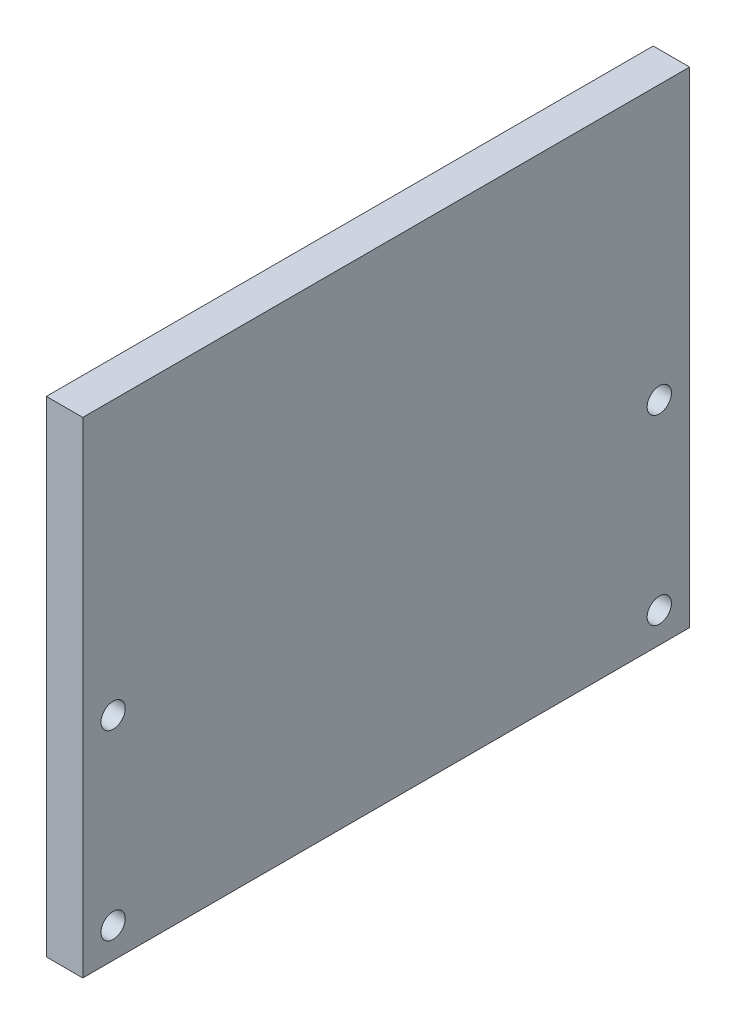
ISO-10303-21;
HEADER;
FILE_DESCRIPTION(('STEP AP214'),'2;1');
FILE_NAME('part.step','',(''),(''),'','','');
FILE_SCHEMA(('AUTOMOTIVE_DESIGN { 1 0 10303 214 1 1 1 1 }'));
ENDSEC;
DATA;
#1=APPLICATION_CONTEXT('core data for automotive mechanical design processes');
#2=APPLICATION_PROTOCOL_DEFINITION('international standard','automotive_design',2000,#1);
#3=PRODUCT_CONTEXT('',#1,'mechanical');
#4=PRODUCT('Part','Part','',(#3));
#5=PRODUCT_RELATED_PRODUCT_CATEGORY('part','',(#4));
#6=PRODUCT_DEFINITION_FORMATION('','',#4);
#7=PRODUCT_DEFINITION_CONTEXT('part definition',#1,'design');
#8=PRODUCT_DEFINITION('design','',#6,#7);
#9=PRODUCT_DEFINITION_SHAPE('','',#8);
#10=(LENGTH_UNIT() NAMED_UNIT(*) SI_UNIT(.MILLI.,.METRE.));
#11=(NAMED_UNIT(*) PLANE_ANGLE_UNIT() SI_UNIT($,.RADIAN.));
#12=(NAMED_UNIT(*) SI_UNIT($,.STERADIAN.) SOLID_ANGLE_UNIT());
#13=UNCERTAINTY_MEASURE_WITH_UNIT(LENGTH_MEASURE(1.E-05),#10,'distance_accuracy_value','');
#14=(GEOMETRIC_REPRESENTATION_CONTEXT(3) GLOBAL_UNCERTAINTY_ASSIGNED_CONTEXT((#13)) GLOBAL_UNIT_ASSIGNED_CONTEXT((#10,
#11,#12)) REPRESENTATION_CONTEXT('',''));
#15=CARTESIAN_POINT('',(0.,0.,0.));
#16=DIRECTION('',(0.,0.,1.));
#17=DIRECTION('',(1.,0.,0.));
#18=AXIS2_PLACEMENT_3D('',#15,#16,#17);
#19=CARTESIAN_POINT('',(3.,0.,0.));
#20=DIRECTION('',(1.,0.,0.));
#21=DIRECTION('',(0.,0.,-1.));
#22=AXIS2_PLACEMENT_3D('',#19,#20,#21);
#23=PLANE('',#22);
#24=CARTESIAN_POINT('',(3.,-2.5,-21.538461538468));
#25=DIRECTION('',(1.,0.,0.));
#26=DIRECTION('',(0.,0.,-1.));
#27=AXIS2_PLACEMENT_3D('',#24,#25,#26);
#28=CIRCLE('',#27,0.999999999999998);
#29=CARTESIAN_POINT('',(3.,-2.5,-22.538461538468));
#30=VERTEX_POINT('',#29);
#31=EDGE_CURVE('E137',#30,#30,#28,.T.);
#32=ORIENTED_EDGE('',*,*,#31,.F.);
#33=EDGE_LOOP('',(#32));
#34=FACE_BOUND('',#33,.T.);
#35=CARTESIAN_POINT('',(3.,-17.5,23.4615384615319));
#36=DIRECTION('',(1.,0.,0.));
#37=DIRECTION('',(0.,0.,-1.));
#38=AXIS2_PLACEMENT_3D('',#35,#36,#37);
#39=CIRCLE('',#38,0.999999999999998);
#40=CARTESIAN_POINT('',(3.,-17.5,22.461538461532));
#41=VERTEX_POINT('',#40);
#42=EDGE_CURVE('E103',#41,#41,#39,.T.);
#43=ORIENTED_EDGE('',*,*,#42,.F.);
#44=EDGE_LOOP('',(#43));
#45=FACE_BOUND('',#44,.T.);
#46=DIRECTION('',(0.,-1.,0.));
#47=VECTOR('',#46,1.);
#48=CARTESIAN_POINT('',(3.,0.,25.961538461532));
#49=LINE('',#48,#47);
#50=CARTESIAN_POINT('',(3.,20.,25.961538461532));
#51=VERTEX_POINT('',#50);
#52=CARTESIAN_POINT('',(3.,-20.,25.9615384615319));
#53=VERTEX_POINT('',#52);
#54=EDGE_CURVE('E86',#51,#53,#49,.T.);
#55=ORIENTED_EDGE('',*,*,#54,.T.);
#56=DIRECTION('',(0.,0.,-1.));
#57=VECTOR('',#56,1.);
#58=CARTESIAN_POINT('',(3.,-20.,25.9615384615319));
#59=LINE('',#58,#57);
#60=CARTESIAN_POINT('',(3.,-20.,-24.0384615384681));
#61=VERTEX_POINT('',#60);
#62=EDGE_CURVE('E81',#53,#61,#59,.T.);
#63=ORIENTED_EDGE('',*,*,#62,.T.);
#64=DIRECTION('',(0.,1.,0.));
#65=VECTOR('',#64,1.);
#66=CARTESIAN_POINT('',(3.,-20.,-24.0384615384681));
#67=LINE('',#66,#65);
#68=CARTESIAN_POINT('',(3.,20.,-24.0384615384681));
#69=VERTEX_POINT('',#68);
#70=EDGE_CURVE('E84',#61,#69,#67,.T.);
#71=ORIENTED_EDGE('',*,*,#70,.T.);
#72=DIRECTION('',(0.,0.,1.));
#73=VECTOR('',#72,1.);
#74=CARTESIAN_POINT('',(3.,20.,0.961538461531948));
#75=LINE('',#74,#73);
#76=EDGE_CURVE('E53',#69,#51,#75,.T.);
#77=ORIENTED_EDGE('',*,*,#76,.T.);
#78=EDGE_LOOP('',(#55,#63,#71,#77));
#79=FACE_BOUND('',#78,.T.);
#80=CARTESIAN_POINT('',(3.,-17.5,-21.538461538468));
#81=DIRECTION('',(1.,0.,0.));
#82=DIRECTION('',(0.,0.,1.));
#83=AXIS2_PLACEMENT_3D('',#80,#81,#82);
#84=CIRCLE('',#83,0.999999999999998);
#85=CARTESIAN_POINT('',(3.,-17.5,-20.5384615384681));
#86=VERTEX_POINT('',#85);
#87=EDGE_CURVE('E141',#86,#86,#84,.T.);
#88=ORIENTED_EDGE('',*,*,#87,.F.);
#89=EDGE_LOOP('',(#88));
#90=FACE_BOUND('',#89,.T.);
#91=CARTESIAN_POINT('',(3.,-2.5,23.4615384615319));
#92=DIRECTION('',(1.,0.,0.));
#93=DIRECTION('',(0.,0.,1.));
#94=AXIS2_PLACEMENT_3D('',#91,#92,#93);
#95=CIRCLE('',#94,0.999999999999998);
#96=CARTESIAN_POINT('',(3.,-2.5,24.4615384615319));
#97=VERTEX_POINT('',#96);
#98=EDGE_CURVE('E132',#97,#97,#95,.T.);
#99=ORIENTED_EDGE('',*,*,#98,.F.);
#100=EDGE_LOOP('',(#99));
#101=FACE_BOUND('',#100,.T.);
#102=ADVANCED_FACE('F36',(#34,#45,#79,#90,#101),#23,.T.);
#103=CARTESIAN_POINT('',(0.,0.,0.));
#104=DIRECTION('',(1.,0.,0.));
#105=DIRECTION('',(0.,0.,-1.));
#106=AXIS2_PLACEMENT_3D('',#103,#104,#105);
#107=PLANE('',#106);
#108=DIRECTION('',(0.,0.,-1.));
#109=VECTOR('',#108,1.);
#110=CARTESIAN_POINT('',(0.,-20.,25.9615384615319));
#111=LINE('',#110,#109);
#112=CARTESIAN_POINT('',(0.,-20.,25.9615384615319));
#113=VERTEX_POINT('',#112);
#114=CARTESIAN_POINT('',(0.,-20.,-24.0384615384681));
#115=VERTEX_POINT('',#114);
#116=EDGE_CURVE('E92',#113,#115,#111,.T.);
#117=ORIENTED_EDGE('',*,*,#116,.F.);
#118=DIRECTION('',(0.,-1.,0.));
#119=VECTOR('',#118,1.);
#120=CARTESIAN_POINT('',(0.,0.,25.961538461532));
#121=LINE('',#120,#119);
#122=CARTESIAN_POINT('',(0.,20.,25.961538461532));
#123=VERTEX_POINT('',#122);
#124=EDGE_CURVE('E106',#123,#113,#121,.T.);
#125=ORIENTED_EDGE('',*,*,#124,.F.);
#126=DIRECTION('',(0.,0.,1.));
#127=VECTOR('',#126,1.);
#128=CARTESIAN_POINT('',(0.,20.,25.961538461532));
#129=LINE('',#128,#127);
#130=CARTESIAN_POINT('',(0.,20.,-24.0384615384681));
#131=VERTEX_POINT('',#130);
#132=EDGE_CURVE('E69',#131,#123,#129,.T.);
#133=ORIENTED_EDGE('',*,*,#132,.F.);
#134=DIRECTION('',(0.,1.,0.));
#135=VECTOR('',#134,1.);
#136=CARTESIAN_POINT('',(0.,20.,-24.0384615384681));
#137=LINE('',#136,#135);
#138=EDGE_CURVE('E102',#115,#131,#137,.T.);
#139=ORIENTED_EDGE('',*,*,#138,.F.);
#140=EDGE_LOOP('',(#117,#125,#133,#139));
#141=FACE_BOUND('',#140,.T.);
#142=CARTESIAN_POINT('',(0.,-17.5,23.4615384615319));
#143=DIRECTION('',(1.,0.,0.));
#144=DIRECTION('',(0.,0.,-1.));
#145=AXIS2_PLACEMENT_3D('',#142,#143,#144);
#146=CIRCLE('',#145,0.999999999999998);
#147=CARTESIAN_POINT('',(0.,-17.5,22.461538461532));
#148=VERTEX_POINT('',#147);
#149=EDGE_CURVE('E119',#148,#148,#146,.T.);
#150=ORIENTED_EDGE('',*,*,#149,.T.);
#151=EDGE_LOOP('',(#150));
#152=FACE_BOUND('',#151,.T.);
#153=CARTESIAN_POINT('',(0.,-17.5,-21.538461538468));
#154=DIRECTION('',(1.,0.,0.));
#155=DIRECTION('',(0.,0.,1.));
#156=AXIS2_PLACEMENT_3D('',#153,#154,#155);
#157=CIRCLE('',#156,0.999999999999998);
#158=CARTESIAN_POINT('',(0.,-17.5,-20.5384615384681));
#159=VERTEX_POINT('',#158);
#160=EDGE_CURVE('E123',#159,#159,#157,.T.);
#161=ORIENTED_EDGE('',*,*,#160,.T.);
#162=EDGE_LOOP('',(#161));
#163=FACE_BOUND('',#162,.T.);
#164=CARTESIAN_POINT('',(0.,-2.5,-21.538461538468));
#165=DIRECTION('',(1.,0.,0.));
#166=DIRECTION('',(0.,0.,-1.));
#167=AXIS2_PLACEMENT_3D('',#164,#165,#166);
#168=CIRCLE('',#167,0.999999999999998);
#169=CARTESIAN_POINT('',(0.,-2.5,-22.538461538468));
#170=VERTEX_POINT('',#169);
#171=EDGE_CURVE('E127',#170,#170,#168,.T.);
#172=ORIENTED_EDGE('',*,*,#171,.T.);
#173=EDGE_LOOP('',(#172));
#174=FACE_BOUND('',#173,.T.);
#175=CARTESIAN_POINT('',(0.,-2.5,23.4615384615319));
#176=DIRECTION('',(1.,0.,0.));
#177=DIRECTION('',(0.,0.,1.));
#178=AXIS2_PLACEMENT_3D('',#175,#176,#177);
#179=CIRCLE('',#178,0.999999999999998);
#180=CARTESIAN_POINT('',(0.,-2.5,24.4615384615319));
#181=VERTEX_POINT('',#180);
#182=EDGE_CURVE('E130',#181,#181,#179,.T.);
#183=ORIENTED_EDGE('',*,*,#182,.T.);
#184=EDGE_LOOP('',(#183));
#185=FACE_BOUND('',#184,.T.);
#186=ADVANCED_FACE('F112',(#141,#152,#163,#174,#185),#107,.F.);
#187=CARTESIAN_POINT('',(3.,-20.,25.9615384615319));
#188=DIRECTION('',(0.,1.,0.));
#189=DIRECTION('',(0.,0.,1.));
#190=AXIS2_PLACEMENT_3D('',#187,#188,#189);
#191=PLANE('',#190);
#192=ORIENTED_EDGE('',*,*,#116,.T.);
#193=DIRECTION('',(-1.,0.,0.));
#194=VECTOR('',#193,1.);
#195=CARTESIAN_POINT('',(3.,-20.,-24.0384615384681));
#196=LINE('',#195,#194);
#197=EDGE_CURVE('E45',#61,#115,#196,.T.);
#198=ORIENTED_EDGE('',*,*,#197,.F.);
#199=ORIENTED_EDGE('',*,*,#62,.F.);
#200=DIRECTION('',(-1.,0.,0.));
#201=VECTOR('',#200,1.);
#202=CARTESIAN_POINT('',(3.,-20.,25.9615384615319));
#203=LINE('',#202,#201);
#204=EDGE_CURVE('E11',#53,#113,#203,.T.);
#205=ORIENTED_EDGE('',*,*,#204,.T.);
#206=EDGE_LOOP('',(#192,#198,#199,#205));
#207=FACE_BOUND('',#206,.T.);
#208=ADVANCED_FACE('F38',(#207),#191,.F.);
#209=CARTESIAN_POINT('',(3.,20.,-24.0384615384681));
#210=DIRECTION('',(0.,0.,1.));
#211=DIRECTION('',(0.,-1.,0.));
#212=AXIS2_PLACEMENT_3D('',#209,#210,#211);
#213=PLANE('',#212);
#214=ORIENTED_EDGE('',*,*,#138,.T.);
#215=DIRECTION('',(-1.,0.,0.));
#216=VECTOR('',#215,1.);
#217=CARTESIAN_POINT('',(3.,20.,-24.0384615384681));
#218=LINE('',#217,#216);
#219=EDGE_CURVE('E94',#69,#131,#218,.T.);
#220=ORIENTED_EDGE('',*,*,#219,.F.);
#221=ORIENTED_EDGE('',*,*,#70,.F.);
#222=ORIENTED_EDGE('',*,*,#197,.T.);
#223=EDGE_LOOP('',(#214,#220,#221,#222));
#224=FACE_BOUND('',#223,.T.);
#225=ADVANCED_FACE('F95',(#224),#213,.F.);
#226=CARTESIAN_POINT('',(3.,20.,25.961538461532));
#227=DIRECTION('',(0.,-1.,0.));
#228=DIRECTION('',(0.,0.,-1.));
#229=AXIS2_PLACEMENT_3D('',#226,#227,#228);
#230=PLANE('',#229);
#231=ORIENTED_EDGE('',*,*,#132,.T.);
#232=DIRECTION('',(-1.,0.,0.));
#233=VECTOR('',#232,1.);
#234=CARTESIAN_POINT('',(3.,20.,25.961538461532));
#235=LINE('',#234,#233);
#236=EDGE_CURVE('E97',#51,#123,#235,.T.);
#237=ORIENTED_EDGE('',*,*,#236,.F.);
#238=ORIENTED_EDGE('',*,*,#76,.F.);
#239=ORIENTED_EDGE('',*,*,#219,.T.);
#240=EDGE_LOOP('',(#231,#237,#238,#239));
#241=FACE_BOUND('',#240,.T.);
#242=ADVANCED_FACE('F109',(#241),#230,.F.);
#243=CARTESIAN_POINT('',(3.,0.,25.961538461532));
#244=DIRECTION('',(0.,0.,-1.));
#245=DIRECTION('',(-1.,0.,0.));
#246=AXIS2_PLACEMENT_3D('',#243,#244,#245);
#247=PLANE('',#246);
#248=ORIENTED_EDGE('',*,*,#124,.T.);
#249=ORIENTED_EDGE('',*,*,#204,.F.);
#250=ORIENTED_EDGE('',*,*,#54,.F.);
#251=ORIENTED_EDGE('',*,*,#236,.T.);
#252=EDGE_LOOP('',(#248,#249,#250,#251));
#253=FACE_BOUND('',#252,.T.);
#254=ADVANCED_FACE('F111',(#253),#247,.F.);
#255=CARTESIAN_POINT('',(3.,-17.5,23.4615384615319));
#256=DIRECTION('',(-1.,0.,0.));
#257=DIRECTION('',(0.,0.,1.));
#258=AXIS2_PLACEMENT_3D('',#255,#256,#257);
#259=CYLINDRICAL_SURFACE('',#258,0.999999999999998);
#260=ORIENTED_EDGE('',*,*,#42,.T.);
#261=EDGE_LOOP('',(#260));
#262=FACE_BOUND('',#261,.T.);
#263=ORIENTED_EDGE('',*,*,#149,.F.);
#264=EDGE_LOOP('',(#263));
#265=FACE_BOUND('',#264,.T.);
#266=ADVANCED_FACE('F149',(#262,#265),#259,.F.);
#267=CARTESIAN_POINT('',(3.,-17.5,-21.538461538468));
#268=DIRECTION('',(-1.,0.,0.));
#269=DIRECTION('',(0.,0.,1.));
#270=AXIS2_PLACEMENT_3D('',#267,#268,#269);
#271=CYLINDRICAL_SURFACE('',#270,0.999999999999998);
#272=ORIENTED_EDGE('',*,*,#87,.T.);
#273=EDGE_LOOP('',(#272));
#274=FACE_BOUND('',#273,.T.);
#275=ORIENTED_EDGE('',*,*,#160,.F.);
#276=EDGE_LOOP('',(#275));
#277=FACE_BOUND('',#276,.T.);
#278=ADVANCED_FACE('F213',(#274,#277),#271,.F.);
#279=CARTESIAN_POINT('',(3.,-2.5,-21.538461538468));
#280=DIRECTION('',(-1.,0.,0.));
#281=DIRECTION('',(0.,0.,1.));
#282=AXIS2_PLACEMENT_3D('',#279,#280,#281);
#283=CYLINDRICAL_SURFACE('',#282,0.999999999999998);
#284=ORIENTED_EDGE('',*,*,#31,.T.);
#285=EDGE_LOOP('',(#284));
#286=FACE_BOUND('',#285,.T.);
#287=ORIENTED_EDGE('',*,*,#171,.F.);
#288=EDGE_LOOP('',(#287));
#289=FACE_BOUND('',#288,.T.);
#290=ADVANCED_FACE('F220',(#286,#289),#283,.F.);
#291=CARTESIAN_POINT('',(3.,-2.5,23.4615384615319));
#292=DIRECTION('',(-1.,0.,0.));
#293=DIRECTION('',(0.,0.,1.));
#294=AXIS2_PLACEMENT_3D('',#291,#292,#293);
#295=CYLINDRICAL_SURFACE('',#294,0.999999999999998);
#296=ORIENTED_EDGE('',*,*,#98,.T.);
#297=EDGE_LOOP('',(#296));
#298=FACE_BOUND('',#297,.T.);
#299=ORIENTED_EDGE('',*,*,#182,.F.);
#300=EDGE_LOOP('',(#299));
#301=FACE_BOUND('',#300,.T.);
#302=ADVANCED_FACE('F228',(#298,#301),#295,.F.);
#303=CLOSED_SHELL('',(#102,#186,#208,#225,#242,#254,#266,#278,#290,#302));
#304=MANIFOLD_SOLID_BREP('B2',#303);
#305=ADVANCED_BREP_SHAPE_REPRESENTATION('',(#18,#304),#14);
#306=SHAPE_DEFINITION_REPRESENTATION(#9,#305);
ENDSEC;
END-ISO-10303-21;
